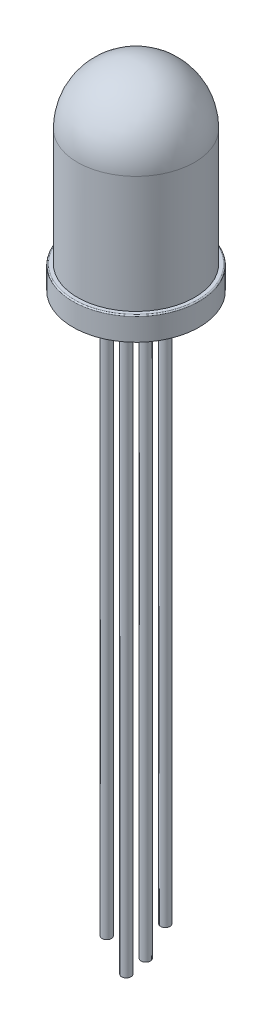
ISO-10303-21;
HEADER;
FILE_DESCRIPTION(('STEP AP214'),'2;1');
FILE_NAME('part.step','',(''),(''),'','','');
FILE_SCHEMA(('AUTOMOTIVE_DESIGN { 1 0 10303 214 1 1 1 1 }'));
ENDSEC;
DATA;
#1=APPLICATION_CONTEXT('core data for automotive mechanical design processes');
#2=APPLICATION_PROTOCOL_DEFINITION('international standard','automotive_design',2000,#1);
#3=PRODUCT_CONTEXT('',#1,'mechanical');
#4=PRODUCT('Part','Part','',(#3));
#5=PRODUCT_RELATED_PRODUCT_CATEGORY('part','',(#4));
#6=PRODUCT_DEFINITION_FORMATION('','',#4);
#7=PRODUCT_DEFINITION_CONTEXT('part definition',#1,'design');
#8=PRODUCT_DEFINITION('design','',#6,#7);
#9=PRODUCT_DEFINITION_SHAPE('','',#8);
#10=(LENGTH_UNIT() NAMED_UNIT(*) SI_UNIT(.MILLI.,.METRE.));
#11=(NAMED_UNIT(*) PLANE_ANGLE_UNIT() SI_UNIT($,.RADIAN.));
#12=(NAMED_UNIT(*) SI_UNIT($,.STERADIAN.) SOLID_ANGLE_UNIT());
#13=UNCERTAINTY_MEASURE_WITH_UNIT(LENGTH_MEASURE(1.E-05),#10,'distance_accuracy_value','');
#14=(GEOMETRIC_REPRESENTATION_CONTEXT(3) GLOBAL_UNCERTAINTY_ASSIGNED_CONTEXT((#13)) GLOBAL_UNIT_ASSIGNED_CONTEXT((#10,
#11,#12)) REPRESENTATION_CONTEXT('',''));
#15=CARTESIAN_POINT('',(0.,0.,0.));
#16=DIRECTION('',(0.,0.,1.));
#17=DIRECTION('',(1.,0.,0.));
#18=AXIS2_PLACEMENT_3D('',#15,#16,#17);
#19=CARTESIAN_POINT('',(0.,6.,0.));
#20=DIRECTION('',(0.,1.,0.));
#21=DIRECTION('',(0.,0.,-1.));
#22=AXIS2_PLACEMENT_3D('',#19,#20,#21);
#23=SPHERICAL_SURFACE('',#22,2.5);
#24=CARTESIAN_POINT('',(0.,6.,0.));
#25=DIRECTION('',(0.,1.,0.));
#26=DIRECTION('',(1.,0.,0.));
#27=AXIS2_PLACEMENT_3D('',#24,#25,#26);
#28=CIRCLE('',#27,2.5);
#29=CARTESIAN_POINT('',(0.,6.,2.5));
#30=VERTEX_POINT('',#29);
#31=CARTESIAN_POINT('',(0.,6.,-2.5));
#32=VERTEX_POINT('',#31);
#33=EDGE_CURVE('E191',#30,#32,#28,.T.);
#34=ORIENTED_EDGE('',*,*,#33,.T.);
#35=CARTESIAN_POINT('',(0.,6.,0.));
#36=DIRECTION('',(0.,1.,0.));
#37=DIRECTION('',(1.,0.,0.));
#38=AXIS2_PLACEMENT_3D('',#35,#36,#37);
#39=CIRCLE('',#38,2.5);
#40=EDGE_CURVE('E181',#32,#30,#39,.T.);
#41=ORIENTED_EDGE('',*,*,#40,.T.);
#42=CARTESIAN_POINT('',(0.,6.,0.));
#43=DIRECTION('',(1.,0.,0.));
#44=DIRECTION('',(0.,0.,1.));
#45=AXIS2_PLACEMENT_3D('',#42,#43,#44);
#46=CIRCLE('',#45,2.5);
#47=CARTESIAN_POINT('',(0.,8.5,0.));
#48=VERTEX_POINT('',#47);
#49=EDGE_CURVE('E11',#48,#30,#46,.T.);
#50=ORIENTED_EDGE('',*,*,#49,.F.);
#51=ORIENTED_EDGE('',*,*,#49,.T.);
#52=EDGE_LOOP('',(#34,#41,#50,#51));
#53=FACE_BOUND('',#52,.T.);
#54=ADVANCED_FACE('F16',(#53),#23,.T.);
#55=CARTESIAN_POINT('',(0.,3.5,0.));
#56=DIRECTION('',(0.,1.,0.));
#57=DIRECTION('',(0.,0.,1.));
#58=AXIS2_PLACEMENT_3D('',#55,#56,#57);
#59=CYLINDRICAL_SURFACE('',#58,2.5);
#60=ORIENTED_EDGE('',*,*,#33,.F.);
#61=ORIENTED_EDGE('',*,*,#40,.F.);
#62=DIRECTION('',(0.,-1.,0.));
#63=VECTOR('',#62,1.);
#64=CARTESIAN_POINT('',(0.,3.5,-2.5));
#65=LINE('',#64,#63);
#66=CARTESIAN_POINT('',(0.,1.,-2.5));
#67=VERTEX_POINT('',#66);
#68=EDGE_CURVE('E24',#32,#67,#65,.T.);
#69=ORIENTED_EDGE('',*,*,#68,.T.);
#70=CARTESIAN_POINT('',(0.,1.,0.));
#71=DIRECTION('',(0.,1.,0.));
#72=DIRECTION('',(1.,0.,0.));
#73=AXIS2_PLACEMENT_3D('',#70,#71,#72);
#74=CIRCLE('',#73,2.5);
#75=EDGE_CURVE('E188',#67,#67,#74,.T.);
#76=ORIENTED_EDGE('',*,*,#75,.T.);
#77=ORIENTED_EDGE('',*,*,#68,.F.);
#78=EDGE_LOOP('',(#60,#61,#69,#76,#77));
#79=FACE_BOUND('',#78,.T.);
#80=ADVANCED_FACE('F197',(#79),#59,.T.);
#81=CARTESIAN_POINT('',(0.,1.,2.5));
#82=DIRECTION('',(0.,1.,0.));
#83=DIRECTION('',(1.,0.,0.));
#84=AXIS2_PLACEMENT_3D('',#81,#82,#83);
#85=PLANE('',#84);
#86=ORIENTED_EDGE('',*,*,#75,.F.);
#87=EDGE_LOOP('',(#86));
#88=FACE_BOUND('',#87,.T.);
#89=CARTESIAN_POINT('',(0.,1.,0.));
#90=DIRECTION('',(0.,-1.,0.));
#91=DIRECTION('',(0.,0.,-1.));
#92=AXIS2_PLACEMENT_3D('',#89,#90,#91);
#93=CIRCLE('',#92,2.65);
#94=CARTESIAN_POINT('',(0.,1.,-2.65));
#95=VERTEX_POINT('',#94);
#96=EDGE_CURVE('E170',#95,#95,#93,.T.);
#97=ORIENTED_EDGE('',*,*,#96,.F.);
#98=EDGE_LOOP('',(#97));
#99=FACE_BOUND('',#98,.T.);
#100=ADVANCED_FACE('F199',(#88,#99),#85,.T.);
#101=CARTESIAN_POINT('',(0.,0.5,0.));
#102=DIRECTION('',(0.,1.,0.));
#103=DIRECTION('',(0.,0.,1.));
#104=AXIS2_PLACEMENT_3D('',#101,#102,#103);
#105=CYLINDRICAL_SURFACE('',#104,2.7);
#106=CARTESIAN_POINT('',(0.,0.95,0.));
#107=DIRECTION('',(0.,1.,0.));
#108=DIRECTION('',(0.,0.,-1.));
#109=AXIS2_PLACEMENT_3D('',#106,#107,#108);
#110=CIRCLE('',#109,2.7);
#111=CARTESIAN_POINT('',(0.,0.95,-2.7));
#112=VERTEX_POINT('',#111);
#113=EDGE_CURVE('E178',#112,#112,#110,.T.);
#114=ORIENTED_EDGE('',*,*,#113,.F.);
#115=DIRECTION('',(0.,-1.,0.));
#116=VECTOR('',#115,1.);
#117=CARTESIAN_POINT('',(0.,0.5,-2.7));
#118=LINE('',#117,#116);
#119=CARTESIAN_POINT('',(0.,0.,-2.7));
#120=VERTEX_POINT('',#119);
#121=EDGE_CURVE('E185',#112,#120,#118,.T.);
#122=ORIENTED_EDGE('',*,*,#121,.T.);
#123=CARTESIAN_POINT('',(0.,0.,0.));
#124=DIRECTION('',(0.,1.,0.));
#125=DIRECTION('',(1.,0.,0.));
#126=AXIS2_PLACEMENT_3D('',#123,#124,#125);
#127=CIRCLE('',#126,2.7);
#128=EDGE_CURVE('E155',#120,#120,#127,.T.);
#129=ORIENTED_EDGE('',*,*,#128,.T.);
#130=ORIENTED_EDGE('',*,*,#121,.F.);
#131=EDGE_LOOP('',(#114,#122,#129,#130));
#132=FACE_BOUND('',#131,.T.);
#133=ADVANCED_FACE('F207',(#132),#105,.T.);
#134=CARTESIAN_POINT('',(0.,0.95,0.));
#135=DIRECTION('',(0.,1.,0.));
#136=DIRECTION('',(0.,0.,1.));
#137=AXIS2_PLACEMENT_3D('',#134,#135,#136);
#138=TOROIDAL_SURFACE('',#137,2.65,0.05);
#139=ORIENTED_EDGE('',*,*,#96,.T.);
#140=CARTESIAN_POINT('',(0.,0.95,-2.65));
#141=DIRECTION('',(-1.,0.,0.));
#142=DIRECTION('',(0.,0.,-1.));
#143=AXIS2_PLACEMENT_3D('',#140,#141,#142);
#144=CIRCLE('',#143,0.05);
#145=EDGE_CURVE('E174',#95,#112,#144,.T.);
#146=ORIENTED_EDGE('',*,*,#145,.T.);
#147=ORIENTED_EDGE('',*,*,#113,.T.);
#148=ORIENTED_EDGE('',*,*,#145,.F.);
#149=EDGE_LOOP('',(#139,#146,#147,#148));
#150=FACE_BOUND('',#149,.T.);
#151=ADVANCED_FACE('F249',(#150),#138,.T.);
#152=CARTESIAN_POINT('',(-1.25,0.,0.));
#153=DIRECTION('',(0.,-1.,0.));
#154=DIRECTION('',(1.,0.,0.));
#155=AXIS2_PLACEMENT_3D('',#152,#153,#154);
#156=CYLINDRICAL_SURFACE('',#155,0.2);
#157=CARTESIAN_POINT('',(-1.25,-24.5,0.));
#158=DIRECTION('',(0.,1.,0.));
#159=DIRECTION('',(1.,0.,0.));
#160=AXIS2_PLACEMENT_3D('',#157,#158,#159);
#161=CIRCLE('',#160,0.2);
#162=CARTESIAN_POINT('',(-1.45,-24.5,0.));
#163=VERTEX_POINT('',#162);
#164=EDGE_CURVE('E117',#163,#163,#161,.T.);
#165=ORIENTED_EDGE('',*,*,#164,.T.);
#166=DIRECTION('',(0.,1.,0.));
#167=VECTOR('',#166,1.);
#168=CARTESIAN_POINT('',(-1.45,0.,0.));
#169=LINE('',#168,#167);
#170=CARTESIAN_POINT('',(-1.45,0.2,0.));
#171=VERTEX_POINT('',#170);
#172=EDGE_CURVE('E167',#163,#171,#169,.T.);
#173=ORIENTED_EDGE('',*,*,#172,.T.);
#174=CARTESIAN_POINT('',(-1.25,0.2,0.));
#175=DIRECTION('',(0.,-1.,0.));
#176=DIRECTION('',(1.,0.,0.));
#177=AXIS2_PLACEMENT_3D('',#174,#175,#176);
#178=CIRCLE('',#177,0.2);
#179=EDGE_CURVE('E151',#171,#171,#178,.T.);
#180=ORIENTED_EDGE('',*,*,#179,.T.);
#181=ORIENTED_EDGE('',*,*,#172,.F.);
#182=EDGE_LOOP('',(#165,#173,#180,#181));
#183=FACE_BOUND('',#182,.T.);
#184=ADVANCED_FACE('F243',(#183),#156,.T.);
#185=CARTESIAN_POINT('',(1.25,0.,0.));
#186=DIRECTION('',(0.,-1.,0.));
#187=DIRECTION('',(1.,0.,0.));
#188=AXIS2_PLACEMENT_3D('',#185,#186,#187);
#189=CYLINDRICAL_SURFACE('',#188,0.2);
#190=CARTESIAN_POINT('',(1.25,-22.8,0.));
#191=DIRECTION('',(0.,1.,0.));
#192=DIRECTION('',(1.,0.,0.));
#193=AXIS2_PLACEMENT_3D('',#190,#191,#192);
#194=CIRCLE('',#193,0.2);
#195=CARTESIAN_POINT('',(1.05,-22.8,0.));
#196=VERTEX_POINT('',#195);
#197=EDGE_CURVE('E124',#196,#196,#194,.T.);
#198=ORIENTED_EDGE('',*,*,#197,.T.);
#199=DIRECTION('',(0.,1.,0.));
#200=VECTOR('',#199,1.);
#201=CARTESIAN_POINT('',(1.05,0.,0.));
#202=LINE('',#201,#200);
#203=CARTESIAN_POINT('',(1.05,0.2,0.));
#204=VERTEX_POINT('',#203);
#205=EDGE_CURVE('E159',#196,#204,#202,.T.);
#206=ORIENTED_EDGE('',*,*,#205,.T.);
#207=CARTESIAN_POINT('',(1.25,0.2,0.));
#208=DIRECTION('',(0.,-1.,0.));
#209=DIRECTION('',(1.,0.,0.));
#210=AXIS2_PLACEMENT_3D('',#207,#208,#209);
#211=CIRCLE('',#210,0.2);
#212=EDGE_CURVE('E147',#204,#204,#211,.T.);
#213=ORIENTED_EDGE('',*,*,#212,.T.);
#214=ORIENTED_EDGE('',*,*,#205,.F.);
#215=EDGE_LOOP('',(#198,#206,#213,#214));
#216=FACE_BOUND('',#215,.T.);
#217=ADVANCED_FACE('F240',(#216),#189,.T.);
#218=CARTESIAN_POINT('',(0.,0.,2.7));
#219=DIRECTION('',(0.,-1.,0.));
#220=DIRECTION('',(0.,0.,-1.));
#221=AXIS2_PLACEMENT_3D('',#218,#219,#220);
#222=PLANE('',#221);
#223=CARTESIAN_POINT('',(0.,0.,0.));
#224=DIRECTION('',(0.,1.,0.));
#225=DIRECTION('',(1.,0.,0.));
#226=AXIS2_PLACEMENT_3D('',#223,#224,#225);
#227=CIRCLE('',#226,2.5);
#228=CARTESIAN_POINT('',(0.0135660304317828,0.,2.4999631922927));
#229=VERTEX_POINT('',#228);
#230=EDGE_CURVE('E131',#229,#229,#227,.T.);
#231=ORIENTED_EDGE('',*,*,#230,.T.);
#232=EDGE_LOOP('',(#231));
#233=FACE_BOUND('',#232,.T.);
#234=ORIENTED_EDGE('',*,*,#128,.F.);
#235=EDGE_LOOP('',(#234));
#236=FACE_BOUND('',#235,.T.);
#237=ADVANCED_FACE('F238',(#233,#236),#222,.T.);
#238=CARTESIAN_POINT('',(0.416666666666666,0.,0.));
#239=DIRECTION('',(0.,1.,0.));
#240=DIRECTION('',(1.,0.,0.));
#241=AXIS2_PLACEMENT_3D('',#238,#239,#240);
#242=CYLINDRICAL_SURFACE('',#241,0.2);
#243=CARTESIAN_POINT('',(0.416666666666666,-24.5,0.));
#244=DIRECTION('',(0.,-1.,0.));
#245=DIRECTION('',(1.,0.,0.));
#246=AXIS2_PLACEMENT_3D('',#243,#244,#245);
#247=CIRCLE('',#246,0.2);
#248=CARTESIAN_POINT('',(0.216666666666666,-24.5,0.));
#249=VERTEX_POINT('',#248);
#250=EDGE_CURVE('E127',#249,#249,#247,.T.);
#251=ORIENTED_EDGE('',*,*,#250,.F.);
#252=DIRECTION('',(0.,1.,0.));
#253=VECTOR('',#252,1.);
#254=CARTESIAN_POINT('',(0.216666666666666,0.,0.));
#255=LINE('',#254,#253);
#256=CARTESIAN_POINT('',(0.216666666666666,0.2,0.));
#257=VERTEX_POINT('',#256);
#258=EDGE_CURVE('E111',#249,#257,#255,.T.);
#259=ORIENTED_EDGE('',*,*,#258,.T.);
#260=CARTESIAN_POINT('',(0.416666666666666,0.2,0.));
#261=DIRECTION('',(0.,-1.,0.));
#262=DIRECTION('',(1.,0.,0.));
#263=AXIS2_PLACEMENT_3D('',#260,#261,#262);
#264=CIRCLE('',#263,0.2);
#265=EDGE_CURVE('E112',#257,#257,#264,.T.);
#266=ORIENTED_EDGE('',*,*,#265,.T.);
#267=ORIENTED_EDGE('',*,*,#258,.F.);
#268=EDGE_LOOP('',(#251,#259,#266,#267));
#269=FACE_BOUND('',#268,.T.);
#270=ADVANCED_FACE('F235',(#269),#242,.T.);
#271=CARTESIAN_POINT('',(-0.416666666666667,0.,0.));
#272=DIRECTION('',(0.,1.,0.));
#273=DIRECTION('',(1.,0.,0.));
#274=AXIS2_PLACEMENT_3D('',#271,#272,#273);
#275=CYLINDRICAL_SURFACE('',#274,0.2);
#276=CARTESIAN_POINT('',(-0.416666666666667,-25.5,0.));
#277=DIRECTION('',(0.,-1.,0.));
#278=DIRECTION('',(1.,0.,0.));
#279=AXIS2_PLACEMENT_3D('',#276,#277,#278);
#280=CIRCLE('',#279,0.2);
#281=CARTESIAN_POINT('',(-0.616666666666667,-25.5,0.));
#282=VERTEX_POINT('',#281);
#283=EDGE_CURVE('E107',#282,#282,#280,.T.);
#284=ORIENTED_EDGE('',*,*,#283,.F.);
#285=DIRECTION('',(0.,1.,0.));
#286=VECTOR('',#285,1.);
#287=CARTESIAN_POINT('',(-0.616666666666667,0.,0.));
#288=LINE('',#287,#286);
#289=CARTESIAN_POINT('',(-0.616666666666667,0.2,0.));
#290=VERTEX_POINT('',#289);
#291=EDGE_CURVE('E104',#282,#290,#288,.T.);
#292=ORIENTED_EDGE('',*,*,#291,.T.);
#293=CARTESIAN_POINT('',(-0.416666666666667,0.2,0.));
#294=DIRECTION('',(0.,-1.,0.));
#295=DIRECTION('',(1.,0.,0.));
#296=AXIS2_PLACEMENT_3D('',#293,#294,#295);
#297=CIRCLE('',#296,0.2);
#298=EDGE_CURVE('E109',#290,#290,#297,.T.);
#299=ORIENTED_EDGE('',*,*,#298,.T.);
#300=ORIENTED_EDGE('',*,*,#291,.F.);
#301=EDGE_LOOP('',(#284,#292,#299,#300));
#302=FACE_BOUND('',#301,.T.);
#303=ADVANCED_FACE('F106',(#302),#275,.T.);
#304=CARTESIAN_POINT('',(0.,0.2,0.));
#305=DIRECTION('',(0.,-1.,0.));
#306=DIRECTION('',(0.,0.,-1.));
#307=AXIS2_PLACEMENT_3D('',#304,#305,#306);
#308=PLANE('',#307);
#309=ORIENTED_EDGE('',*,*,#265,.F.);
#310=EDGE_LOOP('',(#309));
#311=FACE_BOUND('',#310,.T.);
#312=ORIENTED_EDGE('',*,*,#179,.F.);
#313=EDGE_LOOP('',(#312));
#314=FACE_BOUND('',#313,.T.);
#315=ORIENTED_EDGE('',*,*,#212,.F.);
#316=EDGE_LOOP('',(#315));
#317=FACE_BOUND('',#316,.T.);
#318=ORIENTED_EDGE('',*,*,#298,.F.);
#319=EDGE_LOOP('',(#318));
#320=FACE_BOUND('',#319,.T.);
#321=CARTESIAN_POINT('',(0.,0.2,0.));
#322=DIRECTION('',(0.,1.,0.));
#323=DIRECTION('',(-0.00542641217271324,0.,-0.999985276917081));
#324=AXIS2_PLACEMENT_3D('',#321,#322,#323);
#325=CIRCLE('',#324,1.62822021129187);
#326=CARTESIAN_POINT('',(0.00883539397441211,0.2,1.62819623887068));
#327=VERTEX_POINT('',#326);
#328=EDGE_CURVE('E142',#327,#327,#325,.T.);
#329=ORIENTED_EDGE('',*,*,#328,.F.);
#330=EDGE_LOOP('',(#329));
#331=FACE_BOUND('',#330,.T.);
#332=ADVANCED_FACE('F223',(#311,#314,#317,#320,#331),#308,.T.);
#333=CARTESIAN_POINT('',(0.00883539397441191,0.2,1.62819623887068));
#334=CARTESIAN_POINT('',(-1.61936084489627,0.2,1.6370316328451));
#335=CARTESIAN_POINT('',(-1.62819623887068,0.2,0.00883539397441191));
#336=CARTESIAN_POINT('',(-1.6370316328451,0.2,-1.61936084489627));
#337=CARTESIAN_POINT('',(-0.00883539397441191,0.2,-1.62819623887068));
#338=CARTESIAN_POINT('',(1.61936084489627,0.2,-1.6370316328451));
#339=CARTESIAN_POINT('',(1.62819623887068,0.2,-0.00883539397441191));
#340=CARTESIAN_POINT('',(1.6370316328451,0.2,1.61936084489627));
#341=CARTESIAN_POINT('',(0.00883539397441191,0.2,1.62819623887068));
#342=CARTESIAN_POINT('',(0.0113252026361862,0.2,2.08702095119806));
#343=CARTESIAN_POINT('',(-2.07569574856188,0.2,2.09834615383425));
#344=CARTESIAN_POINT('',(-2.08702095119806,0.2,0.0113252026361862));
#345=CARTESIAN_POINT('',(-2.09834615383425,0.2,-2.07569574856188));
#346=CARTESIAN_POINT('',(-0.0113252026361862,0.2,-2.08702095119806));
#347=CARTESIAN_POINT('',(2.07569574856188,0.2,-2.09834615383425));
#348=CARTESIAN_POINT('',(2.08702095119806,0.2,-0.0113252026361862));
#349=CARTESIAN_POINT('',(2.09834615383425,0.2,2.07569574856188));
#350=CARTESIAN_POINT('',(0.0113252026361862,0.2,2.08702095119806));
#351=CARTESIAN_POINT('',(0.0135660304317831,0.,2.4999631922927));
#352=CARTESIAN_POINT('',(-2.48639716186092,0.,2.51352922272449));
#353=CARTESIAN_POINT('',(-2.4999631922927,0.,0.0135660304317831));
#354=CARTESIAN_POINT('',(-2.51352922272449,0.,-2.48639716186092));
#355=CARTESIAN_POINT('',(-0.0135660304317831,0.,-2.4999631922927));
#356=CARTESIAN_POINT('',(2.48639716186092,0.,-2.51352922272449));
#357=CARTESIAN_POINT('',(2.4999631922927,0.,-0.0135660304317831));
#358=CARTESIAN_POINT('',(2.51352922272449,0.,2.48639716186092));
#359=CARTESIAN_POINT('',(0.0135660304317831,0.,2.4999631922927));
#360=(BOUNDED_SURFACE() B_SPLINE_SURFACE(2,2,((#333,#334,#335,#336,#337,#338,#339,#340,#341),
(#342,#343,#344,#345,#346,#347,#348,#349,#350),(#351,#352,#353,#354,#355,#356,#357,#358,#359)),
.UNSPECIFIED.,.F.,.T.,.F.) B_SPLINE_SURFACE_WITH_KNOTS((3,3),(3,2,2,2,3),(-1.5707963267949,
-1.11976951499863),(-3.14159265358979,-1.5707963267949,0.,1.5707963267949,3.14159265358979),
.UNSPECIFIED.) GEOMETRIC_REPRESENTATION_ITEM() RATIONAL_B_SPLINE_SURFACE(((1.,0.707106781186548,
1.,0.707106781186548,1.,0.707106781186548,1.,0.707106781186548,1.),(0.974679434480887,
0.689202437604505,0.974679434480887,0.689202437604505,0.974679434480887,0.689202437604505,
0.974679434480887,0.689202437604505,0.974679434480887),(1.,0.707106781186548,1.,
0.707106781186548,1.,0.707106781186548,1.,0.707106781186548,1.))) REPRESENTATION_ITEM('') SURFACE());
#361=CARTESIAN_POINT('',(0.00883539397441171,-1.8,1.62819623887068));
#362=DIRECTION('',(-0.999985276917081,0.,0.00542641217271312));
#363=DIRECTION('',(0.00542641217271312,0.,0.999985276917081));
#364=AXIS2_PLACEMENT_3D('',#361,#362,#363);
#365=CIRCLE('',#364,2.);
#366=EDGE_CURVE('E138',#229,#327,#365,.T.);
#367=ORIENTED_EDGE('',*,*,#230,.F.);
#368=ORIENTED_EDGE('',*,*,#366,.T.);
#369=ORIENTED_EDGE('',*,*,#328,.T.);
#370=ORIENTED_EDGE('',*,*,#366,.F.);
#371=EDGE_LOOP('',(#367,#368,#369,#370));
#372=FACE_BOUND('',#371,.T.);
#373=ADVANCED_FACE('F217',(#372),#360,.T.);
#374=CARTESIAN_POINT('',(0.,-24.5,2.7));
#375=DIRECTION('',(0.,-1.,0.));
#376=DIRECTION('',(0.,0.,-1.));
#377=AXIS2_PLACEMENT_3D('',#374,#375,#376);
#378=PLANE('',#377);
#379=ORIENTED_EDGE('',*,*,#250,.T.);
#380=EDGE_LOOP('',(#379));
#381=FACE_BOUND('',#380,.T.);
#382=ADVANCED_FACE('F214',(#381),#378,.T.);
#383=CARTESIAN_POINT('',(1.25,-22.8,0.));
#384=DIRECTION('',(0.,1.,0.));
#385=DIRECTION('',(1.,0.,0.));
#386=AXIS2_PLACEMENT_3D('',#383,#384,#385);
#387=PLANE('',#386);
#388=ORIENTED_EDGE('',*,*,#197,.F.);
#389=EDGE_LOOP('',(#388));
#390=FACE_BOUND('',#389,.T.);
#391=ADVANCED_FACE('F212',(#390),#387,.F.);
#392=CARTESIAN_POINT('',(-1.25,-24.5,0.));
#393=DIRECTION('',(0.,1.,0.));
#394=DIRECTION('',(1.,0.,0.));
#395=AXIS2_PLACEMENT_3D('',#392,#393,#394);
#396=PLANE('',#395);
#397=ORIENTED_EDGE('',*,*,#164,.F.);
#398=EDGE_LOOP('',(#397));
#399=FACE_BOUND('',#398,.T.);
#400=ADVANCED_FACE('F269',(#399),#396,.F.);
#401=CARTESIAN_POINT('',(0.,-25.5,2.7));
#402=DIRECTION('',(0.,-1.,0.));
#403=DIRECTION('',(0.,0.,-1.));
#404=AXIS2_PLACEMENT_3D('',#401,#402,#403);
#405=PLANE('',#404);
#406=ORIENTED_EDGE('',*,*,#283,.T.);
#407=EDGE_LOOP('',(#406));
#408=FACE_BOUND('',#407,.T.);
#409=ADVANCED_FACE('F115',(#408),#405,.T.);
#410=CLOSED_SHELL('',(#54,#80,#100,#133,#151,#184,#217,#237,#270,#303,#332,#373,#382,#391,#400,#409));
#411=MANIFOLD_SOLID_BREP('B1',#410);
#412=ADVANCED_BREP_SHAPE_REPRESENTATION('',(#18,#411),#14);
#413=SHAPE_DEFINITION_REPRESENTATION(#9,#412);
ENDSEC;
END-ISO-10303-21;
